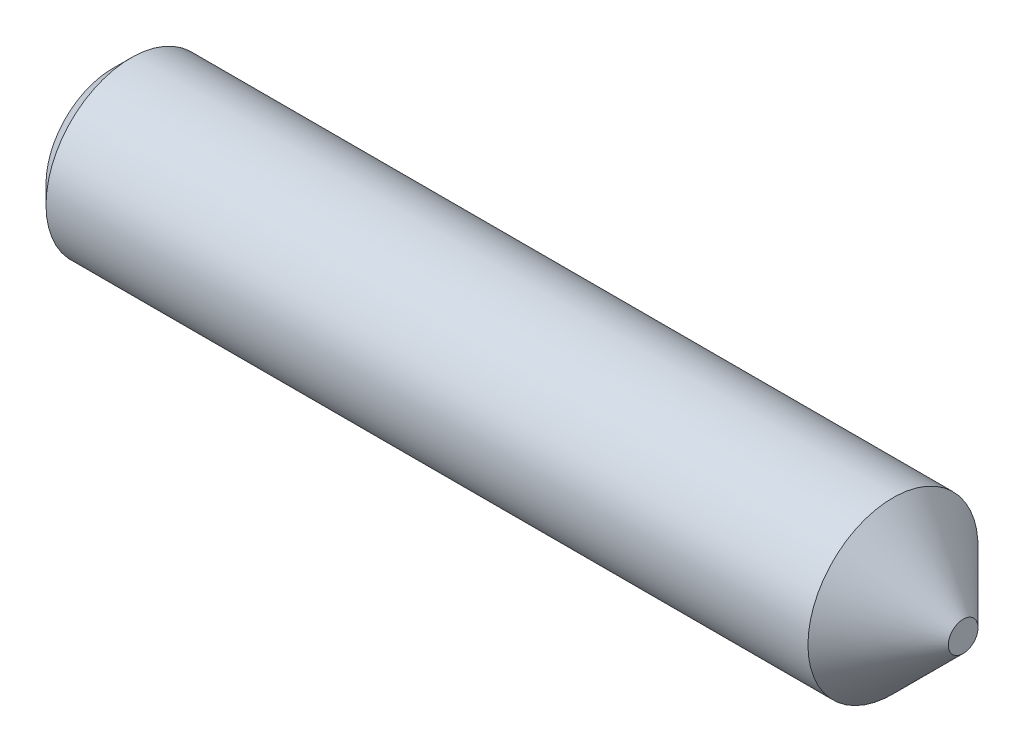
ISO-10303-21;
HEADER;
FILE_DESCRIPTION(('STEP AP214'),'2;1');
FILE_NAME('part.step','',(''),(''),'','','');
FILE_SCHEMA(('AUTOMOTIVE_DESIGN { 1 0 10303 214 1 1 1 1 }'));
ENDSEC;
DATA;
#1=APPLICATION_CONTEXT('core data for automotive mechanical design processes');
#2=APPLICATION_PROTOCOL_DEFINITION('international standard','automotive_design',2000,#1);
#3=PRODUCT_CONTEXT('',#1,'mechanical');
#4=PRODUCT('Part','Part','',(#3));
#5=PRODUCT_RELATED_PRODUCT_CATEGORY('part','',(#4));
#6=PRODUCT_DEFINITION_FORMATION('','',#4);
#7=PRODUCT_DEFINITION_CONTEXT('part definition',#1,'design');
#8=PRODUCT_DEFINITION('design','',#6,#7);
#9=PRODUCT_DEFINITION_SHAPE('','',#8);
#10=(LENGTH_UNIT() NAMED_UNIT(*) SI_UNIT(.MILLI.,.METRE.));
#11=(NAMED_UNIT(*) PLANE_ANGLE_UNIT() SI_UNIT($,.RADIAN.));
#12=(NAMED_UNIT(*) SI_UNIT($,.STERADIAN.) SOLID_ANGLE_UNIT());
#13=UNCERTAINTY_MEASURE_WITH_UNIT(LENGTH_MEASURE(1.E-05),#10,'distance_accuracy_value','');
#14=(GEOMETRIC_REPRESENTATION_CONTEXT(3) GLOBAL_UNCERTAINTY_ASSIGNED_CONTEXT((#13)) GLOBAL_UNIT_ASSIGNED_CONTEXT((#10,
#11,#12)) REPRESENTATION_CONTEXT('',''));
#15=CARTESIAN_POINT('',(0.,0.,0.));
#16=DIRECTION('',(0.,0.,1.));
#17=DIRECTION('',(1.,0.,0.));
#18=AXIS2_PLACEMENT_3D('',#15,#16,#17);
#19=CARTESIAN_POINT('',(0.,0.,0.));
#20=DIRECTION('',(1.,0.,0.));
#21=DIRECTION('',(0.,0.,-1.));
#22=AXIS2_PLACEMENT_3D('',#19,#20,#21);
#23=CYLINDRICAL_SURFACE('',#22,2.);
#24=CARTESIAN_POINT('',(0.429499999936204,0.,0.));
#25=DIRECTION('',(-1.,0.,0.));
#26=DIRECTION('',(0.,0.,1.));
#27=AXIS2_PLACEMENT_3D('',#24,#25,#26);
#28=CIRCLE('',#27,2.);
#29=CARTESIAN_POINT('',(0.429499999936204,0.,2.));
#30=VERTEX_POINT('',#29);
#31=EDGE_CURVE('E42',#30,#30,#28,.F.);
#32=ORIENTED_EDGE('',*,*,#31,.T.);
#33=EDGE_LOOP('',(#32));
#34=FACE_BOUND('',#33,.T.);
#35=CARTESIAN_POINT('',(18.35,0.,0.));
#36=DIRECTION('',(1.,0.,0.));
#37=DIRECTION('',(0.,0.,-1.));
#38=AXIS2_PLACEMENT_3D('',#35,#36,#37);
#39=CIRCLE('',#38,2.);
#40=CARTESIAN_POINT('',(18.35,0.,2.));
#41=VERTEX_POINT('',#40);
#42=EDGE_CURVE('E136',#41,#41,#39,.T.);
#43=ORIENTED_EDGE('',*,*,#42,.F.);
#44=EDGE_LOOP('',(#43));
#45=FACE_BOUND('',#44,.T.);
#46=ADVANCED_FACE('F34',(#34,#45),#23,.T.);
#47=CARTESIAN_POINT('',(0.,2.,0.));
#48=DIRECTION('',(-1.,0.,0.));
#49=DIRECTION('',(0.,0.,1.));
#50=AXIS2_PLACEMENT_3D('',#47,#48,#49);
#51=PLANE('',#50);
#52=CARTESIAN_POINT('',(0.,0.,0.));
#53=DIRECTION('',(-1.,0.,0.));
#54=DIRECTION('',(0.,0.,1.));
#55=AXIS2_PLACEMENT_3D('',#52,#53,#54);
#56=CIRCLE('',#55,1.57050000006379);
#57=CARTESIAN_POINT('',(0.,0.,1.57050000006379));
#58=VERTEX_POINT('',#57);
#59=EDGE_CURVE('E11',#58,#58,#56,.T.);
#60=ORIENTED_EDGE('',*,*,#59,.T.);
#61=EDGE_LOOP('',(#60));
#62=FACE_BOUND('',#61,.T.);
#63=DIRECTION('',(0.,0.866025403784439,-0.499999999999999));
#64=VECTOR('',#63,1.);
#65=CARTESIAN_POINT('',(0.,0.,1.15470053837925));
#66=LINE('',#65,#64);
#67=CARTESIAN_POINT('',(0.,0.,1.15470053837925));
#68=VERTEX_POINT('',#67);
#69=CARTESIAN_POINT('',(0.,1.,0.577350269189625));
#70=VERTEX_POINT('',#69);
#71=EDGE_CURVE('E49',#68,#70,#66,.T.);
#72=ORIENTED_EDGE('',*,*,#71,.F.);
#73=DIRECTION('',(0.,0.866025403784439,0.499999999999999));
#74=VECTOR('',#73,1.);
#75=CARTESIAN_POINT('',(0.,-0.999999999999999,0.577350269189626));
#76=LINE('',#75,#74);
#77=CARTESIAN_POINT('',(0.,-0.999999999999999,0.577350269189626));
#78=VERTEX_POINT('',#77);
#79=EDGE_CURVE('E132',#78,#68,#76,.T.);
#80=ORIENTED_EDGE('',*,*,#79,.F.);
#81=DIRECTION('',(0.,0.,1.));
#82=VECTOR('',#81,1.);
#83=CARTESIAN_POINT('',(0.,-1.,-0.577350269189626));
#84=LINE('',#83,#82);
#85=CARTESIAN_POINT('',(0.,-1.,-0.577350269189626));
#86=VERTEX_POINT('',#85);
#87=EDGE_CURVE('E130',#86,#78,#84,.T.);
#88=ORIENTED_EDGE('',*,*,#87,.F.);
#89=DIRECTION('',(0.,-0.866025403784439,0.5));
#90=VECTOR('',#89,1.);
#91=CARTESIAN_POINT('',(0.,0.,-1.15470053837925));
#92=LINE('',#91,#90);
#93=CARTESIAN_POINT('',(0.,0.,-1.15470053837925));
#94=VERTEX_POINT('',#93);
#95=EDGE_CURVE('E97',#94,#86,#92,.T.);
#96=ORIENTED_EDGE('',*,*,#95,.F.);
#97=DIRECTION('',(0.,-0.86602540378444,-0.499999999999999));
#98=VECTOR('',#97,1.);
#99=CARTESIAN_POINT('',(0.,1.,-0.577350269189627));
#100=LINE('',#99,#98);
#101=CARTESIAN_POINT('',(0.,1.,-0.577350269189627));
#102=VERTEX_POINT('',#101);
#103=EDGE_CURVE('E126',#102,#94,#100,.T.);
#104=ORIENTED_EDGE('',*,*,#103,.F.);
#105=DIRECTION('',(0.,0.,-1.));
#106=VECTOR('',#105,1.);
#107=CARTESIAN_POINT('',(0.,1.,0.577350269189625));
#108=LINE('',#107,#106);
#109=EDGE_CURVE('E123',#70,#102,#108,.T.);
#110=ORIENTED_EDGE('',*,*,#109,.F.);
#111=EDGE_LOOP('',(#72,#80,#88,#96,#104,#110));
#112=FACE_BOUND('',#111,.T.);
#113=ADVANCED_FACE('F160',(#62,#112),#51,.T.);
#114=CARTESIAN_POINT('',(19.9999999999018,0.,0.));
#115=DIRECTION('',(1.,0.,0.));
#116=DIRECTION('',(0.,0.,-1.));
#117=AXIS2_PLACEMENT_3D('',#114,#115,#116);
#118=PLANE('',#117);
#119=CARTESIAN_POINT('',(19.9999999999018,0.,0.));
#120=DIRECTION('',(1.,0.,0.));
#121=DIRECTION('',(0.,0.,-1.));
#122=AXIS2_PLACEMENT_3D('',#119,#120,#121);
#123=CIRCLE('',#122,0.350000000098183);
#124=CARTESIAN_POINT('',(19.9999999999018,0.,0.350000000098185));
#125=VERTEX_POINT('',#124);
#126=EDGE_CURVE('E144',#125,#125,#123,.T.);
#127=ORIENTED_EDGE('',*,*,#126,.T.);
#128=EDGE_LOOP('',(#127));
#129=FACE_BOUND('',#128,.T.);
#130=ADVANCED_FACE('F164',(#129),#118,.T.);
#131=CARTESIAN_POINT('',(19.9999999999018,0.,0.));
#132=DIRECTION('',(-1.,0.,0.));
#133=DIRECTION('',(0.,0.,1.));
#134=AXIS2_PLACEMENT_3D('',#131,#132,#133);
#135=CONICAL_SURFACE('',#134,0.350000000098183,0.785398163397447);
#136=CARTESIAN_POINT('',(18.35,0.,2.));
#137=CARTESIAN_POINT('',(18.367187499999,0.,1.98281250000102));
#138=CARTESIAN_POINT('',(18.384374999998,0.,1.96562500000205));
#139=CARTESIAN_POINT('',(18.4187499999959,0.,1.93125000000409));
#140=CARTESIAN_POINT('',(18.4359374999949,0.,1.91406250000512));
#141=CARTESIAN_POINT('',(18.4703124999928,0.,1.87968750000716));
#142=CARTESIAN_POINT('',(18.4874999999918,0.,1.86250000000818));
#143=CARTESIAN_POINT('',(18.5218749999898,0.,1.82812500001023));
#144=CARTESIAN_POINT('',(18.5390624999888,0.,1.81093750001125));
#145=CARTESIAN_POINT('',(18.5734374999867,0.,1.7765625000133));
#146=CARTESIAN_POINT('',(18.5906249999857,0.,1.75937500001432));
#147=CARTESIAN_POINT('',(18.6249999999836,0.,1.72500000001637));
#148=CARTESIAN_POINT('',(18.6421874999826,0.,1.70781250001739));
#149=CARTESIAN_POINT('',(18.6765624999806,0.,1.67343750001943));
#150=CARTESIAN_POINT('',(18.6937499999795,0.,1.65625000002046));
#151=CARTESIAN_POINT('',(18.7281249999775,0.,1.6218750000225));
#152=CARTESIAN_POINT('',(18.7453124999765,0.,1.60468750002353));
#153=CARTESIAN_POINT('',(18.7796874999744,0.,1.57031250002557));
#154=CARTESIAN_POINT('',(18.7968749999734,0.,1.55312500002659));
#155=CARTESIAN_POINT('',(18.8312499999714,0.,1.51875000002864));
#156=CARTESIAN_POINT('',(18.8484374999703,0.,1.50156250002966));
#157=CARTESIAN_POINT('',(18.8828124999683,0.,1.46718750003171));
#158=CARTESIAN_POINT('',(18.8999999999673,0.,1.45000000003273));
#159=CARTESIAN_POINT('',(18.9343749999652,0.,1.41562500003477));
#160=CARTESIAN_POINT('',(18.9515624999642,0.,1.3984375000358));
#161=CARTESIAN_POINT('',(18.9859374999622,0.,1.36406250003784));
#162=CARTESIAN_POINT('',(19.0031249999611,0.,1.34687500003887));
#163=CARTESIAN_POINT('',(19.0374999999591,0.,1.31250000004091));
#164=CARTESIAN_POINT('',(19.0546874999581,0.,1.29531250004193));
#165=CARTESIAN_POINT('',(19.089062499956,0.,1.26093750004398));
#166=CARTESIAN_POINT('',(19.106249999955,0.,1.243750000045));
#167=CARTESIAN_POINT('',(19.140624999953,0.,1.20937500004705));
#168=CARTESIAN_POINT('',(19.1578124999519,0.,1.19218750004807));
#169=CARTESIAN_POINT('',(19.1921874999499,0.,1.15781250005012));
#170=CARTESIAN_POINT('',(19.2093749999489,0.,1.14062500005114));
#171=CARTESIAN_POINT('',(19.2437499999468,0.,1.10625000005318));
#172=CARTESIAN_POINT('',(19.2609374999458,0.,1.08906250005421));
#173=CARTESIAN_POINT('',(19.2953124999438,0.,1.05468750005625));
#174=CARTESIAN_POINT('',(19.3124999999427,0.,1.03750000005727));
#175=CARTESIAN_POINT('',(19.3468749999407,0.,1.00312500005932));
#176=CARTESIAN_POINT('',(19.3640624999397,0.,0.985937500060344));
#177=CARTESIAN_POINT('',(19.3984374999376,0.,0.951562500062389));
#178=CARTESIAN_POINT('',(19.4156249999366,0.,0.934375000063412));
#179=CARTESIAN_POINT('',(19.4499999999346,0.,0.900000000065457));
#180=CARTESIAN_POINT('',(19.4671874999335,0.,0.882812500066479));
#181=CARTESIAN_POINT('',(19.5015624999315,0.,0.848437500068525));
#182=CARTESIAN_POINT('',(19.5187499999305,0.,0.831250000069548));
#183=CARTESIAN_POINT('',(19.5531249999284,0.,0.796875000071594));
#184=CARTESIAN_POINT('',(19.5703124999274,0.,0.779687500072616));
#185=CARTESIAN_POINT('',(19.6046874999253,0.,0.745312500074661));
#186=CARTESIAN_POINT('',(19.6218749999243,0.,0.728125000075684));
#187=CARTESIAN_POINT('',(19.6562499999223,0.,0.69375000007773));
#188=CARTESIAN_POINT('',(19.6734374999213,0.,0.676562500078753));
#189=CARTESIAN_POINT('',(19.7078124999192,0.,0.642187500080798));
#190=CARTESIAN_POINT('',(19.7249999999182,0.,0.625000000081821));
#191=CARTESIAN_POINT('',(19.7593749999161,0.,0.590625000083866));
#192=CARTESIAN_POINT('',(19.7765624999151,0.,0.573437500084889));
#193=CARTESIAN_POINT('',(19.8109374999131,0.,0.539062500086934));
#194=CARTESIAN_POINT('',(19.8281249999121,0.,0.521875000087957));
#195=CARTESIAN_POINT('',(19.86249999991,0.,0.487500000090003));
#196=CARTESIAN_POINT('',(19.879687499909,0.,0.470312500091026));
#197=CARTESIAN_POINT('',(19.9140624999069,0.,0.435937500093071));
#198=CARTESIAN_POINT('',(19.9312499999059,0.,0.418750000094093));
#199=CARTESIAN_POINT('',(19.9656249999039,0.,0.384375000096139));
#200=CARTESIAN_POINT('',(19.9828124999028,0.,0.367187500097161));
#201=CARTESIAN_POINT('',(19.9999999999018,0.,0.350000000098185));
#202=B_SPLINE_CURVE_WITH_KNOTS('',3,(#136,#137,#138,#139,#140,#141,#142,#143,#144,#145,#146,
#147,#148,#149,#150,#151,#152,#153,#154,#155,#156,#157,#158,#159,#160,#161,#162,#163,#164,#165,
#166,#167,#168,#169,#170,#171,#172,#173,#174,#175,#176,#177,#178,#179,#180,#181,#182,#183,#184,
#185,#186,#187,#188,#189,#190,#191,#192,#193,#194,#195,#196,#197,#198,#199,#200,#201),
.UNSPECIFIED.,.F.,.F.,(4,2,2,2,2,2,2,2,2,2,2,2,2,2,2,2,2,2,2,2,2,2,2,2,2,2,2,2,2,2,2,2,4),(0.,
0.0729203868055228,0.145840773611046,0.218761160416569,0.291681547222094,0.364601934027617,
0.43752232083314,0.510442707638665,0.583363094444188,0.656283481249711,0.729203868055236,
0.802124254860759,0.875044641666282,0.947965028471807,1.02088541527733,1.09380580208285,
1.16672618888838,1.2396465756939,1.31256696249942,1.38548734930495,1.45840773611047,
1.531328122916,1.60424850972152,1.67716889652704,1.75008928333257,1.82300967013809,
1.89593005694362,1.96885044374914,2.04177083055466,2.11469121736019,2.18761160416571,
2.26053199097123,2.33345237777676),.UNSPECIFIED.);
#203=EDGE_CURVE('BSEAM170',#41,#125,#202,.T.);
#204=ORIENTED_EDGE('',*,*,#42,.T.);
#205=ORIENTED_EDGE('',*,*,#126,.F.);
#206=ORIENTED_EDGE('',*,*,#203,.T.);
#207=ORIENTED_EDGE('',*,*,#203,.F.);
#208=EDGE_LOOP('',(#204,#206,#205,#207));
#209=FACE_BOUND('',#208,.T.);
#210=ADVANCED_FACE('F170',(#209),#135,.T.);
#211=CARTESIAN_POINT('',(3.16666666666667,0.,1.15470053837925));
#212=DIRECTION('',(0.,0.499999999999999,0.866025403784439));
#213=DIRECTION('',(0.,-0.866025403784439,0.499999999999999));
#214=AXIS2_PLACEMENT_3D('',#211,#212,#213);
#215=PLANE('',#214);
#216=ORIENTED_EDGE('',*,*,#71,.T.);
#217=DIRECTION('',(-1.,0.,0.));
#218=VECTOR('',#217,1.);
#219=CARTESIAN_POINT('',(3.16666666666667,1.,0.577350269189625));
#220=LINE('',#219,#218);
#221=CARTESIAN_POINT('',(3.16666666666667,1.,0.577350269189625));
#222=VERTEX_POINT('',#221);
#223=EDGE_CURVE('E79',#222,#70,#220,.T.);
#224=ORIENTED_EDGE('',*,*,#223,.F.);
#225=DIRECTION('',(0.,0.866025403784439,-0.499999999999999));
#226=VECTOR('',#225,1.);
#227=CARTESIAN_POINT('',(3.16666666666667,0.,1.15470053837925));
#228=LINE('',#227,#226);
#229=CARTESIAN_POINT('',(3.16666666666667,0.,1.15470053837925));
#230=VERTEX_POINT('',#229);
#231=EDGE_CURVE('E134',#230,#222,#228,.T.);
#232=ORIENTED_EDGE('',*,*,#231,.F.);
#233=DIRECTION('',(-1.,0.,0.));
#234=VECTOR('',#233,1.);
#235=CARTESIAN_POINT('',(3.16666666666667,0.,1.15470053837925));
#236=LINE('',#235,#234);
#237=EDGE_CURVE('E57',#230,#68,#236,.T.);
#238=ORIENTED_EDGE('',*,*,#237,.T.);
#239=EDGE_LOOP('',(#216,#224,#232,#238));
#240=FACE_BOUND('',#239,.T.);
#241=ADVANCED_FACE('F174',(#240),#215,.F.);
#242=CARTESIAN_POINT('',(3.16666666666667,-0.999999999999999,0.577350269189626));
#243=DIRECTION('',(0.,-0.499999999999999,0.866025403784439));
#244=DIRECTION('',(0.,-0.866025403784439,-0.499999999999999));
#245=AXIS2_PLACEMENT_3D('',#242,#243,#244);
#246=PLANE('',#245);
#247=ORIENTED_EDGE('',*,*,#79,.T.);
#248=ORIENTED_EDGE('',*,*,#237,.F.);
#249=DIRECTION('',(0.,0.866025403784439,0.499999999999999));
#250=VECTOR('',#249,1.);
#251=CARTESIAN_POINT('',(3.16666666666667,-0.999999999999999,0.577350269189626));
#252=LINE('',#251,#250);
#253=CARTESIAN_POINT('',(3.16666666666667,-0.999999999999999,0.577350269189626));
#254=VERTEX_POINT('',#253);
#255=EDGE_CURVE('E109',#254,#230,#252,.T.);
#256=ORIENTED_EDGE('',*,*,#255,.F.);
#257=DIRECTION('',(-1.,0.,0.));
#258=VECTOR('',#257,1.);
#259=CARTESIAN_POINT('',(3.16666666666667,-0.999999999999999,0.577350269189626));
#260=LINE('',#259,#258);
#261=EDGE_CURVE('E101',#254,#78,#260,.T.);
#262=ORIENTED_EDGE('',*,*,#261,.T.);
#263=EDGE_LOOP('',(#247,#248,#256,#262));
#264=FACE_BOUND('',#263,.T.);
#265=ADVANCED_FACE('F178',(#264),#246,.F.);
#266=CARTESIAN_POINT('',(3.16666666666667,-1.,-0.577350269189626));
#267=DIRECTION('',(0.,-1.,0.));
#268=DIRECTION('',(0.,0.,-1.));
#269=AXIS2_PLACEMENT_3D('',#266,#267,#268);
#270=PLANE('',#269);
#271=ORIENTED_EDGE('',*,*,#87,.T.);
#272=ORIENTED_EDGE('',*,*,#261,.F.);
#273=DIRECTION('',(0.,0.,1.));
#274=VECTOR('',#273,1.);
#275=CARTESIAN_POINT('',(3.16666666666667,-1.,-0.577350269189626));
#276=LINE('',#275,#274);
#277=CARTESIAN_POINT('',(3.16666666666667,-1.,-0.577350269189626));
#278=VERTEX_POINT('',#277);
#279=EDGE_CURVE('E105',#278,#254,#276,.T.);
#280=ORIENTED_EDGE('',*,*,#279,.F.);
#281=DIRECTION('',(-1.,0.,0.));
#282=VECTOR('',#281,1.);
#283=CARTESIAN_POINT('',(3.16666666666667,-1.,-0.577350269189626));
#284=LINE('',#283,#282);
#285=EDGE_CURVE('E90',#278,#86,#284,.T.);
#286=ORIENTED_EDGE('',*,*,#285,.T.);
#287=EDGE_LOOP('',(#271,#272,#280,#286));
#288=FACE_BOUND('',#287,.T.);
#289=ADVANCED_FACE('F106',(#288),#270,.F.);
#290=CARTESIAN_POINT('',(3.16666666666667,0.,-1.15470053837925));
#291=DIRECTION('',(0.,-0.5,-0.866025403784439));
#292=DIRECTION('',(0.,0.866025403784439,-0.5));
#293=AXIS2_PLACEMENT_3D('',#290,#291,#292);
#294=PLANE('',#293);
#295=ORIENTED_EDGE('',*,*,#95,.T.);
#296=ORIENTED_EDGE('',*,*,#285,.F.);
#297=DIRECTION('',(0.,-0.866025403784439,0.5));
#298=VECTOR('',#297,1.);
#299=CARTESIAN_POINT('',(3.16666666666667,0.,-1.15470053837925));
#300=LINE('',#299,#298);
#301=CARTESIAN_POINT('',(3.16666666666667,0.,-1.15470053837925));
#302=VERTEX_POINT('',#301);
#303=EDGE_CURVE('E94',#302,#278,#300,.T.);
#304=ORIENTED_EDGE('',*,*,#303,.F.);
#305=DIRECTION('',(-1.,0.,0.));
#306=VECTOR('',#305,1.);
#307=CARTESIAN_POINT('',(3.16666666666667,0.,-1.15470053837925));
#308=LINE('',#307,#306);
#309=EDGE_CURVE('E102',#302,#94,#308,.T.);
#310=ORIENTED_EDGE('',*,*,#309,.T.);
#311=EDGE_LOOP('',(#295,#296,#304,#310));
#312=FACE_BOUND('',#311,.T.);
#313=ADVANCED_FACE('F92',(#312),#294,.F.);
#314=CARTESIAN_POINT('',(3.16666666666667,1.,-0.577350269189627));
#315=DIRECTION('',(0.,0.499999999999998,-0.866025403784439));
#316=DIRECTION('',(0.,0.86602540378444,0.499999999999999));
#317=AXIS2_PLACEMENT_3D('',#314,#315,#316);
#318=PLANE('',#317);
#319=ORIENTED_EDGE('',*,*,#103,.T.);
#320=ORIENTED_EDGE('',*,*,#309,.F.);
#321=DIRECTION('',(0.,-0.86602540378444,-0.499999999999999));
#322=VECTOR('',#321,1.);
#323=CARTESIAN_POINT('',(3.16666666666667,1.,-0.577350269189627));
#324=LINE('',#323,#322);
#325=CARTESIAN_POINT('',(3.16666666666667,1.,-0.577350269189627));
#326=VERTEX_POINT('',#325);
#327=EDGE_CURVE('E115',#326,#302,#324,.T.);
#328=ORIENTED_EDGE('',*,*,#327,.F.);
#329=DIRECTION('',(-1.,0.,0.));
#330=VECTOR('',#329,1.);
#331=CARTESIAN_POINT('',(3.16666666666667,1.,-0.577350269189627));
#332=LINE('',#331,#330);
#333=EDGE_CURVE('E139',#326,#102,#332,.T.);
#334=ORIENTED_EDGE('',*,*,#333,.T.);
#335=EDGE_LOOP('',(#319,#320,#328,#334));
#336=FACE_BOUND('',#335,.T.);
#337=ADVANCED_FACE('F181',(#336),#318,.F.);
#338=CARTESIAN_POINT('',(3.16666666666667,1.,0.577350269189625));
#339=DIRECTION('',(0.,1.,0.));
#340=DIRECTION('',(0.,0.,1.));
#341=AXIS2_PLACEMENT_3D('',#338,#339,#340);
#342=PLANE('',#341);
#343=ORIENTED_EDGE('',*,*,#109,.T.);
#344=ORIENTED_EDGE('',*,*,#333,.F.);
#345=DIRECTION('',(0.,0.,-1.));
#346=VECTOR('',#345,1.);
#347=CARTESIAN_POINT('',(3.16666666666667,1.,0.577350269189625));
#348=LINE('',#347,#346);
#349=EDGE_CURVE('E117',#222,#326,#348,.T.);
#350=ORIENTED_EDGE('',*,*,#349,.F.);
#351=ORIENTED_EDGE('',*,*,#223,.T.);
#352=EDGE_LOOP('',(#343,#344,#350,#351));
#353=FACE_BOUND('',#352,.T.);
#354=ADVANCED_FACE('F156',(#353),#342,.F.);
#355=CARTESIAN_POINT('',(3.16666666666667,0.,0.));
#356=DIRECTION('',(-1.,0.,0.));
#357=DIRECTION('',(0.,0.,1.));
#358=AXIS2_PLACEMENT_3D('',#355,#356,#357);
#359=PLANE('',#358);
#360=ORIENTED_EDGE('',*,*,#231,.T.);
#361=ORIENTED_EDGE('',*,*,#349,.T.);
#362=ORIENTED_EDGE('',*,*,#327,.T.);
#363=ORIENTED_EDGE('',*,*,#303,.T.);
#364=ORIENTED_EDGE('',*,*,#279,.T.);
#365=ORIENTED_EDGE('',*,*,#255,.T.);
#366=EDGE_LOOP('',(#360,#361,#362,#363,#364,#365));
#367=FACE_BOUND('',#366,.T.);
#368=ADVANCED_FACE('F112',(#367),#359,.T.);
#369=CARTESIAN_POINT('',(0.429499999936204,0.,0.));
#370=DIRECTION('',(1.,0.,0.));
#371=DIRECTION('',(0.,0.,-1.));
#372=AXIS2_PLACEMENT_3D('',#369,#370,#371);
#373=CONICAL_SURFACE('',#372,2.,0.785398163397453);
#374=ORIENTED_EDGE('',*,*,#59,.F.);
#375=EDGE_LOOP('',(#374));
#376=FACE_BOUND('',#375,.T.);
#377=ORIENTED_EDGE('',*,*,#31,.F.);
#378=EDGE_LOOP('',(#377));
#379=FACE_BOUND('',#378,.T.);
#380=ADVANCED_FACE('F36',(#376,#379),#373,.T.);
#381=CLOSED_SHELL('',(#46,#113,#130,#210,#241,#265,#289,#313,#337,#354,#368,#380));
#382=MANIFOLD_SOLID_BREP('B2',#381);
#383=ADVANCED_BREP_SHAPE_REPRESENTATION('',(#18,#382),#14);
#384=SHAPE_DEFINITION_REPRESENTATION(#9,#383);
ENDSEC;
END-ISO-10303-21;
